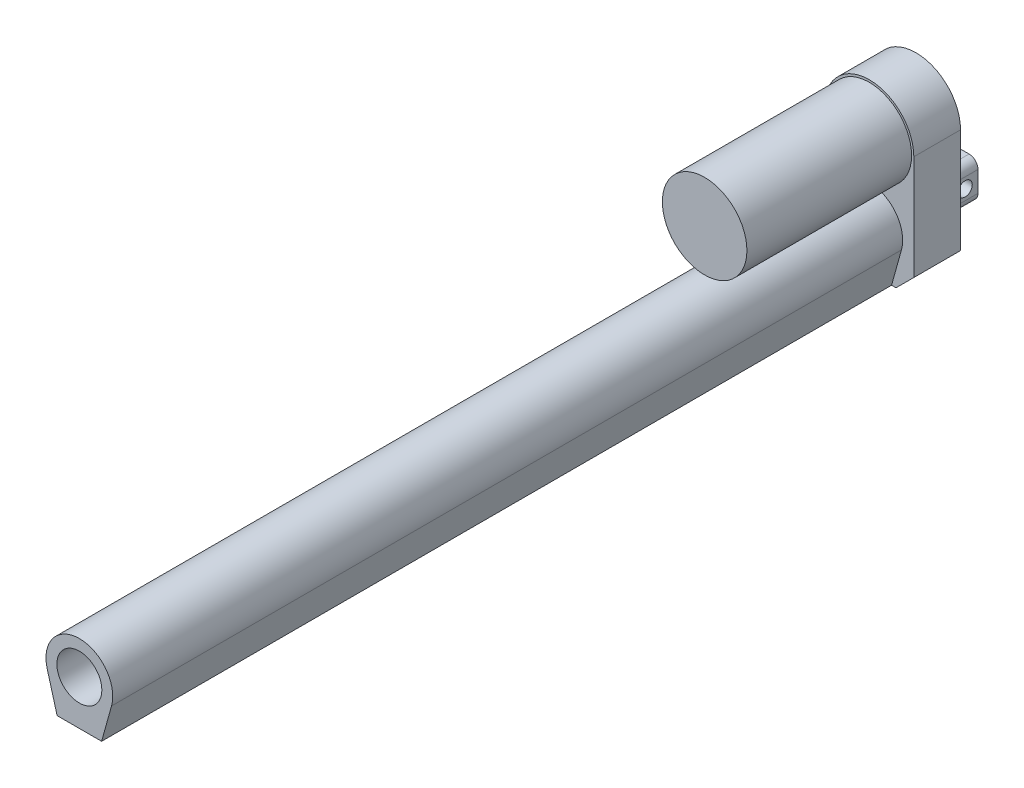
ISO-10303-21;
HEADER;
FILE_DESCRIPTION(('STEP AP214'),'2;1');
FILE_NAME('part.step','',(''),(''),'','','');
FILE_SCHEMA(('AUTOMOTIVE_DESIGN { 1 0 10303 214 1 1 1 1 }'));
ENDSEC;
DATA;
#1=APPLICATION_CONTEXT('core data for automotive mechanical design processes');
#2=APPLICATION_PROTOCOL_DEFINITION('international standard','automotive_design',2000,#1);
#3=PRODUCT_CONTEXT('',#1,'mechanical');
#4=PRODUCT('Part','Part','',(#3));
#5=PRODUCT_RELATED_PRODUCT_CATEGORY('part','',(#4));
#6=PRODUCT_DEFINITION_FORMATION('','',#4);
#7=PRODUCT_DEFINITION_CONTEXT('part definition',#1,'design');
#8=PRODUCT_DEFINITION('design','',#6,#7);
#9=PRODUCT_DEFINITION_SHAPE('','',#8);
#10=(LENGTH_UNIT() NAMED_UNIT(*) SI_UNIT(.MILLI.,.METRE.));
#11=(NAMED_UNIT(*) PLANE_ANGLE_UNIT() SI_UNIT($,.RADIAN.));
#12=(NAMED_UNIT(*) SI_UNIT($,.STERADIAN.) SOLID_ANGLE_UNIT());
#13=UNCERTAINTY_MEASURE_WITH_UNIT(LENGTH_MEASURE(1.E-05),#10,'distance_accuracy_value','');
#14=(GEOMETRIC_REPRESENTATION_CONTEXT(3) GLOBAL_UNCERTAINTY_ASSIGNED_CONTEXT((#13)) GLOBAL_UNIT_ASSIGNED_CONTEXT((#10,
#11,#12)) REPRESENTATION_CONTEXT('',''));
#15=CARTESIAN_POINT('',(0.,0.,0.));
#16=DIRECTION('',(0.,0.,1.));
#17=DIRECTION('',(1.,0.,0.));
#18=AXIS2_PLACEMENT_3D('',#15,#16,#17);
#19=CARTESIAN_POINT('',(0.,17.5,0.));
#20=DIRECTION('',(0.,0.,1.));
#21=DIRECTION('',(1.,0.,0.));
#22=AXIS2_PLACEMENT_3D('',#19,#20,#21);
#23=PLANE('',#22);
#24=DIRECTION('',(0.,-1.,0.));
#25=VECTOR('',#24,1.);
#26=CARTESIAN_POINT('',(-20.,-29.5,0.));
#27=LINE('',#26,#25);
#28=CARTESIAN_POINT('',(-20.,17.5,0.));
#29=VERTEX_POINT('',#28);
#30=CARTESIAN_POINT('',(-20.,-29.5,0.));
#31=VERTEX_POINT('',#30);
#32=EDGE_CURVE('E204',#29,#31,#27,.T.);
#33=ORIENTED_EDGE('',*,*,#32,.F.);
#34=CARTESIAN_POINT('',(0.,17.5,0.));
#35=DIRECTION('',(0.,0.,1.));
#36=DIRECTION('',(1.,0.,0.));
#37=AXIS2_PLACEMENT_3D('',#34,#35,#36);
#38=CIRCLE('',#37,20.);
#39=CARTESIAN_POINT('',(20.,17.5,0.));
#40=VERTEX_POINT('',#39);
#41=EDGE_CURVE('E210',#40,#29,#38,.T.);
#42=ORIENTED_EDGE('',*,*,#41,.F.);
#43=DIRECTION('',(0.,1.,0.));
#44=VECTOR('',#43,1.);
#45=CARTESIAN_POINT('',(20.,-29.5,0.));
#46=LINE('',#45,#44);
#47=CARTESIAN_POINT('',(20.,-29.5,0.));
#48=VERTEX_POINT('',#47);
#49=EDGE_CURVE('E231',#48,#40,#46,.T.);
#50=ORIENTED_EDGE('',*,*,#49,.F.);
#51=DIRECTION('',(0.707106781186546,0.707106781186549,0.));
#52=VECTOR('',#51,1.);
#53=CARTESIAN_POINT('',(12.,-37.5,0.));
#54=LINE('',#53,#52);
#55=CARTESIAN_POINT('',(12.,-37.5,0.));
#56=VERTEX_POINT('',#55);
#57=EDGE_CURVE('E229',#56,#48,#54,.T.);
#58=ORIENTED_EDGE('',*,*,#57,.F.);
#59=DIRECTION('',(1.,0.,0.));
#60=VECTOR('',#59,1.);
#61=CARTESIAN_POINT('',(-12.,-37.5,0.));
#62=LINE('',#61,#60);
#63=CARTESIAN_POINT('',(-12.,-37.5,0.));
#64=VERTEX_POINT('',#63);
#65=EDGE_CURVE('E227',#64,#56,#62,.T.);
#66=ORIENTED_EDGE('',*,*,#65,.F.);
#67=DIRECTION('',(0.707106781186546,-0.707106781186549,0.));
#68=VECTOR('',#67,1.);
#69=CARTESIAN_POINT('',(-12.,-37.5,0.));
#70=LINE('',#69,#68);
#71=EDGE_CURVE('E225',#31,#64,#70,.T.);
#72=ORIENTED_EDGE('',*,*,#71,.F.);
#73=EDGE_LOOP('',(#33,#42,#50,#58,#66,#72));
#74=FACE_BOUND('',#73,.T.);
#75=DIRECTION('',(0.,1.,0.));
#76=VECTOR('',#75,1.);
#77=CARTESIAN_POINT('',(-8.65000000000001,-26.5,0.));
#78=LINE('',#77,#76);
#79=CARTESIAN_POINT('',(-8.65000000000001,-22.5,0.));
#80=VERTEX_POINT('',#79);
#81=CARTESIAN_POINT('',(-8.65000000000001,-13.2,0.));
#82=VERTEX_POINT('',#81);
#83=EDGE_CURVE('E313',#80,#82,#78,.T.);
#84=ORIENTED_EDGE('',*,*,#83,.F.);
#85=CARTESIAN_POINT('',(-4.65000000000001,-22.5,0.));
#86=DIRECTION('',(0.,0.,1.));
#87=DIRECTION('',(1.,0.,0.));
#88=AXIS2_PLACEMENT_3D('',#85,#86,#87);
#89=CIRCLE('',#88,4.);
#90=CARTESIAN_POINT('',(-4.65000000000001,-26.5,0.));
#91=VERTEX_POINT('',#90);
#92=EDGE_CURVE('E11',#80,#91,#89,.T.);
#93=ORIENTED_EDGE('',*,*,#92,.T.);
#94=DIRECTION('',(-1.,0.,0.));
#95=VECTOR('',#94,1.);
#96=CARTESIAN_POINT('',(8.64999999999999,-26.5,0.));
#97=LINE('',#96,#95);
#98=CARTESIAN_POINT('',(4.64999999999999,-26.5,0.));
#99=VERTEX_POINT('',#98);
#100=EDGE_CURVE('E285',#99,#91,#97,.T.);
#101=ORIENTED_EDGE('',*,*,#100,.F.);
#102=CARTESIAN_POINT('',(4.64999999999999,-22.5,0.));
#103=DIRECTION('',(0.,0.,1.));
#104=DIRECTION('',(1.,0.,0.));
#105=AXIS2_PLACEMENT_3D('',#102,#103,#104);
#106=CIRCLE('',#105,4.);
#107=CARTESIAN_POINT('',(8.64999999999999,-22.5,0.));
#108=VERTEX_POINT('',#107);
#109=EDGE_CURVE('E53',#99,#108,#106,.T.);
#110=ORIENTED_EDGE('',*,*,#109,.T.);
#111=DIRECTION('',(0.,-1.,0.));
#112=VECTOR('',#111,1.);
#113=CARTESIAN_POINT('',(8.64999999999999,-26.5,0.));
#114=LINE('',#113,#112);
#115=CARTESIAN_POINT('',(8.64999999999999,-13.2,0.));
#116=VERTEX_POINT('',#115);
#117=EDGE_CURVE('E284',#116,#108,#114,.T.);
#118=ORIENTED_EDGE('',*,*,#117,.F.);
#119=CARTESIAN_POINT('',(4.64999999999999,-13.2,0.));
#120=DIRECTION('',(0.,0.,1.));
#121=DIRECTION('',(1.,0.,0.));
#122=AXIS2_PLACEMENT_3D('',#119,#120,#121);
#123=CIRCLE('',#122,4.);
#124=CARTESIAN_POINT('',(4.64999999999999,-9.19999999999999,0.));
#125=VERTEX_POINT('',#124);
#126=EDGE_CURVE('E280',#116,#125,#123,.T.);
#127=ORIENTED_EDGE('',*,*,#126,.T.);
#128=DIRECTION('',(1.,0.,0.));
#129=VECTOR('',#128,1.);
#130=CARTESIAN_POINT('',(8.64999999999999,-9.19999999999999,0.));
#131=LINE('',#130,#129);
#132=CARTESIAN_POINT('',(-4.65000000000001,-9.19999999999999,0.));
#133=VERTEX_POINT('',#132);
#134=EDGE_CURVE('E291',#133,#125,#131,.T.);
#135=ORIENTED_EDGE('',*,*,#134,.F.);
#136=CARTESIAN_POINT('',(-4.65000000000001,-13.2,0.));
#137=DIRECTION('',(0.,0.,1.));
#138=DIRECTION('',(1.,0.,0.));
#139=AXIS2_PLACEMENT_3D('',#136,#137,#138);
#140=CIRCLE('',#139,4.);
#141=EDGE_CURVE('E278',#133,#82,#140,.T.);
#142=ORIENTED_EDGE('',*,*,#141,.T.);
#143=EDGE_LOOP('',(#84,#93,#101,#110,#118,#127,#135,#142));
#144=FACE_BOUND('',#143,.T.);
#145=ADVANCED_FACE('F44',(#74,#144),#23,.F.);
#146=CARTESIAN_POINT('',(0.,17.5,21.));
#147=DIRECTION('',(0.,0.,1.));
#148=DIRECTION('',(1.,0.,0.));
#149=AXIS2_PLACEMENT_3D('',#146,#147,#148);
#150=PLANE('',#149);
#151=CARTESIAN_POINT('',(0.,17.5,21.));
#152=DIRECTION('',(0.,0.,1.));
#153=DIRECTION('',(1.,0.,0.));
#154=AXIS2_PLACEMENT_3D('',#151,#152,#153);
#155=CIRCLE('',#154,19.);
#156=CARTESIAN_POINT('',(19.,17.5,21.));
#157=VERTEX_POINT('',#156);
#158=EDGE_CURVE('E194',#157,#157,#155,.T.);
#159=ORIENTED_EDGE('',*,*,#158,.F.);
#160=EDGE_LOOP('',(#159));
#161=FACE_BOUND('',#160,.T.);
#162=DIRECTION('',(1.,0.,0.));
#163=VECTOR('',#162,1.);
#164=CARTESIAN_POINT('',(-12.,-37.5,21.));
#165=LINE('',#164,#163);
#166=CARTESIAN_POINT('',(-12.,-37.5,21.));
#167=VERTEX_POINT('',#166);
#168=CARTESIAN_POINT('',(-10.,-37.5,21.));
#169=VERTEX_POINT('',#168);
#170=EDGE_CURVE('E213',#167,#169,#165,.T.);
#171=ORIENTED_EDGE('',*,*,#170,.T.);
#172=DIRECTION('',(0.26833752096446,-0.96332495807108,0.));
#173=VECTOR('',#172,1.);
#174=CARTESIAN_POINT('',(-14.4498743710662,-21.5250628144669,21.));
#175=LINE('',#174,#173);
#176=CARTESIAN_POINT('',(-14.4498743710662,-21.5250628144669,21.));
#177=VERTEX_POINT('',#176);
#178=EDGE_CURVE('E307',#177,#169,#175,.T.);
#179=ORIENTED_EDGE('',*,*,#178,.F.);
#180=CARTESIAN_POINT('',(0.,-17.5,21.));
#181=DIRECTION('',(0.,0.,1.));
#182=DIRECTION('',(1.,0.,0.));
#183=AXIS2_PLACEMENT_3D('',#180,#181,#182);
#184=CIRCLE('',#183,15.);
#185=CARTESIAN_POINT('',(14.4498743710662,-21.5250628144669,21.));
#186=VERTEX_POINT('',#185);
#187=EDGE_CURVE('E192',#186,#177,#184,.T.);
#188=ORIENTED_EDGE('',*,*,#187,.F.);
#189=DIRECTION('',(0.26833752096446,0.96332495807108,0.));
#190=VECTOR('',#189,1.);
#191=CARTESIAN_POINT('',(14.4498743710662,-21.5250628144669,21.));
#192=LINE('',#191,#190);
#193=CARTESIAN_POINT('',(10.,-37.5,21.));
#194=VERTEX_POINT('',#193);
#195=EDGE_CURVE('E188',#194,#186,#192,.T.);
#196=ORIENTED_EDGE('',*,*,#195,.F.);
#197=CARTESIAN_POINT('',(12.,-37.5,21.));
#198=VERTEX_POINT('',#197);
#199=EDGE_CURVE('E212',#194,#198,#165,.T.);
#200=ORIENTED_EDGE('',*,*,#199,.T.);
#201=DIRECTION('',(0.707106781186546,0.707106781186549,0.));
#202=VECTOR('',#201,1.);
#203=CARTESIAN_POINT('',(12.,-37.5,21.));
#204=LINE('',#203,#202);
#205=CARTESIAN_POINT('',(20.,-29.5,21.));
#206=VERTEX_POINT('',#205);
#207=EDGE_CURVE('E216',#198,#206,#204,.T.);
#208=ORIENTED_EDGE('',*,*,#207,.T.);
#209=DIRECTION('',(0.,1.,0.));
#210=VECTOR('',#209,1.);
#211=CARTESIAN_POINT('',(20.,-29.5,21.));
#212=LINE('',#211,#210);
#213=CARTESIAN_POINT('',(20.,17.5,21.));
#214=VERTEX_POINT('',#213);
#215=EDGE_CURVE('E218',#206,#214,#212,.T.);
#216=ORIENTED_EDGE('',*,*,#215,.T.);
#217=CARTESIAN_POINT('',(0.,17.5,21.));
#218=DIRECTION('',(0.,0.,1.));
#219=DIRECTION('',(1.,0.,0.));
#220=AXIS2_PLACEMENT_3D('',#217,#218,#219);
#221=CIRCLE('',#220,20.);
#222=CARTESIAN_POINT('',(-20.,17.5,21.));
#223=VERTEX_POINT('',#222);
#224=EDGE_CURVE('E220',#214,#223,#221,.T.);
#225=ORIENTED_EDGE('',*,*,#224,.T.);
#226=DIRECTION('',(0.,-1.,0.));
#227=VECTOR('',#226,1.);
#228=CARTESIAN_POINT('',(-20.,-29.5,21.));
#229=LINE('',#228,#227);
#230=CARTESIAN_POINT('',(-20.,-29.5,21.));
#231=VERTEX_POINT('',#230);
#232=EDGE_CURVE('E206',#223,#231,#229,.T.);
#233=ORIENTED_EDGE('',*,*,#232,.T.);
#234=DIRECTION('',(0.707106781186546,-0.707106781186549,0.));
#235=VECTOR('',#234,1.);
#236=CARTESIAN_POINT('',(-12.,-37.5,21.));
#237=LINE('',#236,#235);
#238=EDGE_CURVE('E209',#231,#167,#237,.T.);
#239=ORIENTED_EDGE('',*,*,#238,.T.);
#240=EDGE_LOOP('',(#171,#179,#188,#196,#200,#208,#216,#225,#233,#239));
#241=FACE_BOUND('',#240,.T.);
#242=ADVANCED_FACE('F333',(#161,#241),#150,.T.);
#243=CARTESIAN_POINT('',(-20.,-29.5,21.));
#244=DIRECTION('',(1.,0.,0.));
#245=DIRECTION('',(0.,1.,0.));
#246=AXIS2_PLACEMENT_3D('',#243,#244,#245);
#247=PLANE('',#246);
#248=ORIENTED_EDGE('',*,*,#32,.T.);
#249=DIRECTION('',(0.,0.,-1.));
#250=VECTOR('',#249,1.);
#251=CARTESIAN_POINT('',(-20.,-29.5,21.));
#252=LINE('',#251,#250);
#253=EDGE_CURVE('E248',#231,#31,#252,.T.);
#254=ORIENTED_EDGE('',*,*,#253,.F.);
#255=ORIENTED_EDGE('',*,*,#232,.F.);
#256=DIRECTION('',(0.,0.,-1.));
#257=VECTOR('',#256,1.);
#258=CARTESIAN_POINT('',(-20.,17.5,21.));
#259=LINE('',#258,#257);
#260=EDGE_CURVE('E222',#223,#29,#259,.T.);
#261=ORIENTED_EDGE('',*,*,#260,.T.);
#262=EDGE_LOOP('',(#248,#254,#255,#261));
#263=FACE_BOUND('',#262,.T.);
#264=ADVANCED_FACE('F356',(#263),#247,.F.);
#265=CARTESIAN_POINT('',(-12.,-37.5,21.));
#266=DIRECTION('',(0.707106781186549,0.707106781186546,0.));
#267=DIRECTION('',(-0.707106781186546,0.707106781186549,0.));
#268=AXIS2_PLACEMENT_3D('',#265,#266,#267);
#269=PLANE('',#268);
#270=ORIENTED_EDGE('',*,*,#71,.T.);
#271=DIRECTION('',(0.,0.,-1.));
#272=VECTOR('',#271,1.);
#273=CARTESIAN_POINT('',(-12.,-37.5,21.));
#274=LINE('',#273,#272);
#275=EDGE_CURVE('E245',#167,#64,#274,.T.);
#276=ORIENTED_EDGE('',*,*,#275,.F.);
#277=ORIENTED_EDGE('',*,*,#238,.F.);
#278=ORIENTED_EDGE('',*,*,#253,.T.);
#279=EDGE_LOOP('',(#270,#276,#277,#278));
#280=FACE_BOUND('',#279,.T.);
#281=ADVANCED_FACE('F360',(#280),#269,.F.);
#282=CARTESIAN_POINT('',(-12.,-37.5,21.));
#283=DIRECTION('',(0.,1.,0.));
#284=DIRECTION('',(0.,0.,1.));
#285=AXIS2_PLACEMENT_3D('',#282,#283,#284);
#286=PLANE('',#285);
#287=ORIENTED_EDGE('',*,*,#65,.T.);
#288=DIRECTION('',(0.,0.,-1.));
#289=VECTOR('',#288,1.);
#290=CARTESIAN_POINT('',(12.,-37.5,21.));
#291=LINE('',#290,#289);
#292=EDGE_CURVE('E242',#198,#56,#291,.T.);
#293=ORIENTED_EDGE('',*,*,#292,.F.);
#294=ORIENTED_EDGE('',*,*,#199,.F.);
#295=DIRECTION('',(0.,0.,-1.));
#296=VECTOR('',#295,1.);
#297=CARTESIAN_POINT('',(10.,-37.5,376.));
#298=LINE('',#297,#296);
#299=CARTESIAN_POINT('',(10.,-37.5,376.));
#300=VERTEX_POINT('',#299);
#301=EDGE_CURVE('E199',#300,#194,#298,.T.);
#302=ORIENTED_EDGE('',*,*,#301,.F.);
#303=DIRECTION('',(1.,0.,0.));
#304=VECTOR('',#303,1.);
#305=CARTESIAN_POINT('',(-10.,-37.5,376.));
#306=LINE('',#305,#304);
#307=CARTESIAN_POINT('',(-10.,-37.5,376.));
#308=VERTEX_POINT('',#307);
#309=EDGE_CURVE('E178',#308,#300,#306,.T.);
#310=ORIENTED_EDGE('',*,*,#309,.F.);
#311=DIRECTION('',(0.,0.,-1.));
#312=VECTOR('',#311,1.);
#313=CARTESIAN_POINT('',(-10.,-37.5,376.));
#314=LINE('',#313,#312);
#315=EDGE_CURVE('E175',#308,#169,#314,.T.);
#316=ORIENTED_EDGE('',*,*,#315,.T.);
#317=ORIENTED_EDGE('',*,*,#170,.F.);
#318=ORIENTED_EDGE('',*,*,#275,.T.);
#319=EDGE_LOOP('',(#287,#293,#294,#302,#310,#316,#317,#318));
#320=FACE_BOUND('',#319,.T.);
#321=ADVANCED_FACE('F335',(#320),#286,.F.);
#322=CARTESIAN_POINT('',(12.,-37.5,21.));
#323=DIRECTION('',(-0.707106781186549,0.707106781186546,0.));
#324=DIRECTION('',(-0.707106781186546,-0.707106781186549,0.));
#325=AXIS2_PLACEMENT_3D('',#322,#323,#324);
#326=PLANE('',#325);
#327=ORIENTED_EDGE('',*,*,#57,.T.);
#328=DIRECTION('',(0.,0.,-1.));
#329=VECTOR('',#328,1.);
#330=CARTESIAN_POINT('',(20.,-29.5,21.));
#331=LINE('',#330,#329);
#332=EDGE_CURVE('E239',#206,#48,#331,.T.);
#333=ORIENTED_EDGE('',*,*,#332,.F.);
#334=ORIENTED_EDGE('',*,*,#207,.F.);
#335=ORIENTED_EDGE('',*,*,#292,.T.);
#336=EDGE_LOOP('',(#327,#333,#334,#335));
#337=FACE_BOUND('',#336,.T.);
#338=ADVANCED_FACE('F341',(#337),#326,.F.);
#339=CARTESIAN_POINT('',(20.,-29.5,21.));
#340=DIRECTION('',(-1.,0.,0.));
#341=DIRECTION('',(0.,-1.,0.));
#342=AXIS2_PLACEMENT_3D('',#339,#340,#341);
#343=PLANE('',#342);
#344=ORIENTED_EDGE('',*,*,#49,.T.);
#345=DIRECTION('',(0.,0.,-1.));
#346=VECTOR('',#345,1.);
#347=CARTESIAN_POINT('',(20.,17.5,21.));
#348=LINE('',#347,#346);
#349=EDGE_CURVE('E236',#214,#40,#348,.T.);
#350=ORIENTED_EDGE('',*,*,#349,.F.);
#351=ORIENTED_EDGE('',*,*,#215,.F.);
#352=ORIENTED_EDGE('',*,*,#332,.T.);
#353=EDGE_LOOP('',(#344,#350,#351,#352));
#354=FACE_BOUND('',#353,.T.);
#355=ADVANCED_FACE('F347',(#354),#343,.F.);
#356=CARTESIAN_POINT('',(0.,17.5,21.));
#357=DIRECTION('',(0.,0.,-1.));
#358=DIRECTION('',(-1.,0.,0.));
#359=AXIS2_PLACEMENT_3D('',#356,#357,#358);
#360=CYLINDRICAL_SURFACE('',#359,20.);
#361=ORIENTED_EDGE('',*,*,#41,.T.);
#362=ORIENTED_EDGE('',*,*,#260,.F.);
#363=ORIENTED_EDGE('',*,*,#224,.F.);
#364=ORIENTED_EDGE('',*,*,#349,.T.);
#365=EDGE_LOOP('',(#361,#362,#363,#364));
#366=FACE_BOUND('',#365,.T.);
#367=ADVANCED_FACE('F351',(#366),#360,.T.);
#368=CARTESIAN_POINT('',(0.,17.5,95.));
#369=DIRECTION('',(0.,0.,-1.));
#370=DIRECTION('',(-1.,0.,0.));
#371=AXIS2_PLACEMENT_3D('',#368,#369,#370);
#372=CYLINDRICAL_SURFACE('',#371,19.);
#373=CARTESIAN_POINT('',(0.,17.5,95.));
#374=DIRECTION('',(0.,0.,1.));
#375=DIRECTION('',(1.,0.,0.));
#376=AXIS2_PLACEMENT_3D('',#373,#374,#375);
#377=CIRCLE('',#376,19.);
#378=CARTESIAN_POINT('',(19.,17.5,95.));
#379=VERTEX_POINT('',#378);
#380=EDGE_CURVE('E197',#379,#379,#377,.T.);
#381=ORIENTED_EDGE('',*,*,#380,.F.);
#382=EDGE_LOOP('',(#381));
#383=FACE_BOUND('',#382,.T.);
#384=ORIENTED_EDGE('',*,*,#158,.T.);
#385=EDGE_LOOP('',(#384));
#386=FACE_BOUND('',#385,.T.);
#387=ADVANCED_FACE('F373',(#383,#386),#372,.T.);
#388=CARTESIAN_POINT('',(0.,17.5,95.));
#389=DIRECTION('',(0.,0.,1.));
#390=DIRECTION('',(1.,0.,0.));
#391=AXIS2_PLACEMENT_3D('',#388,#389,#390);
#392=PLANE('',#391);
#393=ORIENTED_EDGE('',*,*,#380,.T.);
#394=EDGE_LOOP('',(#393));
#395=FACE_BOUND('',#394,.T.);
#396=ADVANCED_FACE('F456',(#395),#392,.T.);
#397=CARTESIAN_POINT('',(0.,-17.5,376.));
#398=DIRECTION('',(0.,0.,-1.));
#399=DIRECTION('',(-1.,0.,0.));
#400=AXIS2_PLACEMENT_3D('',#397,#398,#399);
#401=CYLINDRICAL_SURFACE('',#400,15.);
#402=ORIENTED_EDGE('',*,*,#187,.T.);
#403=DIRECTION('',(0.,0.,-1.));
#404=VECTOR('',#403,1.);
#405=CARTESIAN_POINT('',(-14.4498743710662,-21.5250628144669,376.));
#406=LINE('',#405,#404);
#407=CARTESIAN_POINT('',(-14.4498743710662,-21.5250628144669,376.));
#408=VERTEX_POINT('',#407);
#409=EDGE_CURVE('E172',#408,#177,#406,.T.);
#410=ORIENTED_EDGE('',*,*,#409,.F.);
#411=CARTESIAN_POINT('',(0.,-17.5,376.));
#412=DIRECTION('',(0.,0.,1.));
#413=DIRECTION('',(1.,0.,0.));
#414=AXIS2_PLACEMENT_3D('',#411,#412,#413);
#415=CIRCLE('',#414,15.);
#416=CARTESIAN_POINT('',(14.4498743710662,-21.5250628144669,376.));
#417=VERTEX_POINT('',#416);
#418=EDGE_CURVE('E179',#417,#408,#415,.T.);
#419=ORIENTED_EDGE('',*,*,#418,.F.);
#420=DIRECTION('',(0.,0.,-1.));
#421=VECTOR('',#420,1.);
#422=CARTESIAN_POINT('',(14.4498743710662,-21.5250628144669,376.));
#423=LINE('',#422,#421);
#424=EDGE_CURVE('E322',#417,#186,#423,.T.);
#425=ORIENTED_EDGE('',*,*,#424,.T.);
#426=EDGE_LOOP('',(#402,#410,#419,#425));
#427=FACE_BOUND('',#426,.T.);
#428=ADVANCED_FACE('F190',(#427),#401,.T.);
#429=CARTESIAN_POINT('',(-14.4498743710662,-21.5250628144669,376.));
#430=DIRECTION('',(0.96332495807108,0.26833752096446,0.));
#431=DIRECTION('',(-0.26833752096446,0.96332495807108,0.));
#432=AXIS2_PLACEMENT_3D('',#429,#430,#431);
#433=PLANE('',#432);
#434=ORIENTED_EDGE('',*,*,#178,.T.);
#435=ORIENTED_EDGE('',*,*,#315,.F.);
#436=DIRECTION('',(0.26833752096446,-0.96332495807108,0.));
#437=VECTOR('',#436,1.);
#438=CARTESIAN_POINT('',(-14.4498743710662,-21.5250628144669,376.));
#439=LINE('',#438,#437);
#440=EDGE_CURVE('E168',#408,#308,#439,.T.);
#441=ORIENTED_EDGE('',*,*,#440,.F.);
#442=ORIENTED_EDGE('',*,*,#409,.T.);
#443=EDGE_LOOP('',(#434,#435,#441,#442));
#444=FACE_BOUND('',#443,.T.);
#445=ADVANCED_FACE('F170',(#444),#433,.F.);
#446=CARTESIAN_POINT('',(14.4498743710662,-21.5250628144669,376.));
#447=DIRECTION('',(-0.96332495807108,0.26833752096446,0.));
#448=DIRECTION('',(-0.26833752096446,-0.96332495807108,0.));
#449=AXIS2_PLACEMENT_3D('',#446,#447,#448);
#450=PLANE('',#449);
#451=ORIENTED_EDGE('',*,*,#195,.T.);
#452=ORIENTED_EDGE('',*,*,#424,.F.);
#453=DIRECTION('',(0.26833752096446,0.96332495807108,0.));
#454=VECTOR('',#453,1.);
#455=CARTESIAN_POINT('',(14.4498743710662,-21.5250628144669,376.));
#456=LINE('',#455,#454);
#457=EDGE_CURVE('E184',#300,#417,#456,.T.);
#458=ORIENTED_EDGE('',*,*,#457,.F.);
#459=ORIENTED_EDGE('',*,*,#301,.T.);
#460=EDGE_LOOP('',(#451,#452,#458,#459));
#461=FACE_BOUND('',#460,.T.);
#462=ADVANCED_FACE('F329',(#461),#450,.F.);
#463=CARTESIAN_POINT('',(0.,-17.5,376.));
#464=DIRECTION('',(0.,0.,1.));
#465=DIRECTION('',(1.,0.,0.));
#466=AXIS2_PLACEMENT_3D('',#463,#464,#465);
#467=PLANE('',#466);
#468=CARTESIAN_POINT('',(0.,-17.5,376.));
#469=DIRECTION('',(0.,0.,1.));
#470=DIRECTION('',(1.,0.,0.));
#471=AXIS2_PLACEMENT_3D('',#468,#469,#470);
#472=CIRCLE('',#471,10.1);
#473=CARTESIAN_POINT('',(10.1,-17.5,376.));
#474=VERTEX_POINT('',#473);
#475=EDGE_CURVE('E412',#474,#474,#472,.T.);
#476=ORIENTED_EDGE('',*,*,#475,.F.);
#477=EDGE_LOOP('',(#476));
#478=FACE_BOUND('',#477,.T.);
#479=ORIENTED_EDGE('',*,*,#418,.T.);
#480=ORIENTED_EDGE('',*,*,#440,.T.);
#481=ORIENTED_EDGE('',*,*,#309,.T.);
#482=ORIENTED_EDGE('',*,*,#457,.T.);
#483=EDGE_LOOP('',(#479,#480,#481,#482));
#484=FACE_BOUND('',#483,.T.);
#485=ADVANCED_FACE('F182',(#478,#484),#467,.T.);
#486=CARTESIAN_POINT('',(-8.65000000000001,-26.5,-19.2));
#487=DIRECTION('',(1.,0.,0.));
#488=DIRECTION('',(0.,0.,-1.));
#489=AXIS2_PLACEMENT_3D('',#486,#487,#488);
#490=PLANE('',#489);
#491=CARTESIAN_POINT('',(-8.65000000000001,-17.85,-13.45));
#492=DIRECTION('',(1.,0.,0.));
#493=DIRECTION('',(0.,0.,-1.));
#494=AXIS2_PLACEMENT_3D('',#491,#492,#493);
#495=CIRCLE('',#494,3.175);
#496=CARTESIAN_POINT('',(-8.65000000000001,-17.85,-16.625));
#497=VERTEX_POINT('',#496);
#498=EDGE_CURVE('E415',#497,#497,#495,.T.);
#499=ORIENTED_EDGE('',*,*,#498,.T.);
#500=EDGE_LOOP('',(#499));
#501=FACE_BOUND('',#500,.T.);
#502=ORIENTED_EDGE('',*,*,#83,.T.);
#503=DIRECTION('',(0.,0.,1.));
#504=VECTOR('',#503,1.);
#505=CARTESIAN_POINT('',(-8.65000000000001,-13.2,-19.2));
#506=LINE('',#505,#504);
#507=CARTESIAN_POINT('',(-8.65000000000001,-13.2,-19.2));
#508=VERTEX_POINT('',#507);
#509=EDGE_CURVE('E259',#82,#508,#506,.F.);
#510=ORIENTED_EDGE('',*,*,#509,.T.);
#511=DIRECTION('',(0.,1.,0.));
#512=VECTOR('',#511,1.);
#513=CARTESIAN_POINT('',(-8.65000000000001,-26.5,-19.2));
#514=LINE('',#513,#512);
#515=CARTESIAN_POINT('',(-8.65000000000001,-22.5,-19.2));
#516=VERTEX_POINT('',#515);
#517=EDGE_CURVE('E319',#516,#508,#514,.T.);
#518=ORIENTED_EDGE('',*,*,#517,.F.);
#519=DIRECTION('',(0.,0.,1.));
#520=VECTOR('',#519,1.);
#521=CARTESIAN_POINT('',(-8.65000000000001,-22.5,-19.2));
#522=LINE('',#521,#520);
#523=EDGE_CURVE('E256',#516,#80,#522,.T.);
#524=ORIENTED_EDGE('',*,*,#523,.T.);
#525=EDGE_LOOP('',(#502,#510,#518,#524));
#526=FACE_BOUND('',#525,.T.);
#527=ADVANCED_FACE('F407',(#501,#526),#490,.F.);
#528=CARTESIAN_POINT('',(8.64999999999999,-9.19999999999999,-19.2));
#529=DIRECTION('',(0.,-1.,0.));
#530=DIRECTION('',(0.,0.,-1.));
#531=AXIS2_PLACEMENT_3D('',#528,#529,#530);
#532=PLANE('',#531);
#533=DIRECTION('',(1.,0.,0.));
#534=VECTOR('',#533,1.);
#535=CARTESIAN_POINT('',(8.64999999999999,-9.19999999999999,-19.2));
#536=LINE('',#535,#534);
#537=CARTESIAN_POINT('',(-4.65000000000001,-9.19999999999999,-19.2));
#538=VERTEX_POINT('',#537);
#539=CARTESIAN_POINT('',(4.64999999999999,-9.19999999999999,-19.2));
#540=VERTEX_POINT('',#539);
#541=EDGE_CURVE('E309',#538,#540,#536,.T.);
#542=ORIENTED_EDGE('',*,*,#541,.F.);
#543=DIRECTION('',(0.,0.,1.));
#544=VECTOR('',#543,1.);
#545=CARTESIAN_POINT('',(-4.65000000000001,-9.19999999999999,-19.2));
#546=LINE('',#545,#544);
#547=EDGE_CURVE('E253',#538,#133,#546,.T.);
#548=ORIENTED_EDGE('',*,*,#547,.T.);
#549=ORIENTED_EDGE('',*,*,#134,.T.);
#550=DIRECTION('',(0.,0.,1.));
#551=VECTOR('',#550,1.);
#552=CARTESIAN_POINT('',(4.64999999999999,-9.19999999999999,-19.2));
#553=LINE('',#552,#551);
#554=EDGE_CURVE('E251',#125,#540,#553,.F.);
#555=ORIENTED_EDGE('',*,*,#554,.T.);
#556=EDGE_LOOP('',(#542,#548,#549,#555));
#557=FACE_BOUND('',#556,.T.);
#558=ADVANCED_FACE('F441',(#557),#532,.F.);
#559=CARTESIAN_POINT('',(8.64999999999999,-26.5,-19.2));
#560=DIRECTION('',(-1.,0.,0.));
#561=DIRECTION('',(0.,0.,1.));
#562=AXIS2_PLACEMENT_3D('',#559,#560,#561);
#563=PLANE('',#562);
#564=CARTESIAN_POINT('',(8.64999999999999,-17.85,-13.45));
#565=DIRECTION('',(-1.,0.,0.));
#566=DIRECTION('',(0.,0.,1.));
#567=AXIS2_PLACEMENT_3D('',#564,#565,#566);
#568=CIRCLE('',#567,3.175);
#569=CARTESIAN_POINT('',(8.64999999999999,-17.85,-10.275));
#570=VERTEX_POINT('',#569);
#571=EDGE_CURVE('E48',#570,#570,#568,.T.);
#572=ORIENTED_EDGE('',*,*,#571,.T.);
#573=EDGE_LOOP('',(#572));
#574=FACE_BOUND('',#573,.T.);
#575=DIRECTION('',(0.,-1.,0.));
#576=VECTOR('',#575,1.);
#577=CARTESIAN_POINT('',(8.64999999999999,-26.5,-19.2));
#578=LINE('',#577,#576);
#579=CARTESIAN_POINT('',(8.64999999999999,-13.2,-19.2));
#580=VERTEX_POINT('',#579);
#581=CARTESIAN_POINT('',(8.64999999999999,-22.5,-19.2));
#582=VERTEX_POINT('',#581);
#583=EDGE_CURVE('E302',#580,#582,#578,.T.);
#584=ORIENTED_EDGE('',*,*,#583,.F.);
#585=DIRECTION('',(0.,0.,1.));
#586=VECTOR('',#585,1.);
#587=CARTESIAN_POINT('',(8.64999999999999,-13.2,-19.2));
#588=LINE('',#587,#586);
#589=EDGE_CURVE('E271',#580,#116,#588,.T.);
#590=ORIENTED_EDGE('',*,*,#589,.T.);
#591=ORIENTED_EDGE('',*,*,#117,.T.);
#592=DIRECTION('',(0.,0.,1.));
#593=VECTOR('',#592,1.);
#594=CARTESIAN_POINT('',(8.64999999999999,-22.5,-19.2));
#595=LINE('',#594,#593);
#596=EDGE_CURVE('E269',#108,#582,#595,.F.);
#597=ORIENTED_EDGE('',*,*,#596,.T.);
#598=EDGE_LOOP('',(#584,#590,#591,#597));
#599=FACE_BOUND('',#598,.T.);
#600=ADVANCED_FACE('F288',(#574,#599),#563,.F.);
#601=CARTESIAN_POINT('',(8.64999999999999,-26.5,-19.2));
#602=DIRECTION('',(0.,1.,0.));
#603=DIRECTION('',(0.,0.,1.));
#604=AXIS2_PLACEMENT_3D('',#601,#602,#603);
#605=PLANE('',#604);
#606=DIRECTION('',(-1.,0.,0.));
#607=VECTOR('',#606,1.);
#608=CARTESIAN_POINT('',(8.64999999999999,-26.5,-19.2));
#609=LINE('',#608,#607);
#610=CARTESIAN_POINT('',(4.64999999999999,-26.5,-19.2));
#611=VERTEX_POINT('',#610);
#612=CARTESIAN_POINT('',(-4.65000000000001,-26.5,-19.2));
#613=VERTEX_POINT('',#612);
#614=EDGE_CURVE('E300',#611,#613,#609,.T.);
#615=ORIENTED_EDGE('',*,*,#614,.F.);
#616=DIRECTION('',(0.,0.,1.));
#617=VECTOR('',#616,1.);
#618=CARTESIAN_POINT('',(4.64999999999999,-26.5,-19.2));
#619=LINE('',#618,#617);
#620=EDGE_CURVE('E276',#611,#99,#619,.T.);
#621=ORIENTED_EDGE('',*,*,#620,.T.);
#622=ORIENTED_EDGE('',*,*,#100,.T.);
#623=DIRECTION('',(0.,0.,1.));
#624=VECTOR('',#623,1.);
#625=CARTESIAN_POINT('',(-4.65000000000001,-26.5,-19.2));
#626=LINE('',#625,#624);
#627=EDGE_CURVE('E274',#91,#613,#626,.F.);
#628=ORIENTED_EDGE('',*,*,#627,.T.);
#629=EDGE_LOOP('',(#615,#621,#622,#628));
#630=FACE_BOUND('',#629,.T.);
#631=ADVANCED_FACE('F304',(#630),#605,.F.);
#632=CARTESIAN_POINT('',(0.,0.,-19.2));
#633=DIRECTION('',(0.,0.,1.));
#634=DIRECTION('',(1.,0.,0.));
#635=AXIS2_PLACEMENT_3D('',#632,#633,#634);
#636=PLANE('',#635);
#637=ORIENTED_EDGE('',*,*,#517,.T.);
#638=CARTESIAN_POINT('',(-4.65000000000001,-13.2,-19.2));
#639=DIRECTION('',(0.,0.,1.));
#640=DIRECTION('',(1.,0.,0.));
#641=AXIS2_PLACEMENT_3D('',#638,#639,#640);
#642=CIRCLE('',#641,4.);
#643=EDGE_CURVE('E267',#508,#538,#642,.F.);
#644=ORIENTED_EDGE('',*,*,#643,.T.);
#645=ORIENTED_EDGE('',*,*,#541,.T.);
#646=CARTESIAN_POINT('',(4.64999999999999,-13.2,-19.2));
#647=DIRECTION('',(0.,0.,1.));
#648=DIRECTION('',(1.,0.,0.));
#649=AXIS2_PLACEMENT_3D('',#646,#647,#648);
#650=CIRCLE('',#649,4.);
#651=EDGE_CURVE('E265',#540,#580,#650,.F.);
#652=ORIENTED_EDGE('',*,*,#651,.T.);
#653=ORIENTED_EDGE('',*,*,#583,.T.);
#654=CARTESIAN_POINT('',(4.64999999999999,-22.5,-19.2));
#655=DIRECTION('',(0.,0.,1.));
#656=DIRECTION('',(1.,0.,0.));
#657=AXIS2_PLACEMENT_3D('',#654,#655,#656);
#658=CIRCLE('',#657,4.);
#659=EDGE_CURVE('E263',#582,#611,#658,.F.);
#660=ORIENTED_EDGE('',*,*,#659,.T.);
#661=ORIENTED_EDGE('',*,*,#614,.T.);
#662=CARTESIAN_POINT('',(-4.65000000000001,-22.5,-19.2));
#663=DIRECTION('',(0.,0.,1.));
#664=DIRECTION('',(1.,0.,0.));
#665=AXIS2_PLACEMENT_3D('',#662,#663,#664);
#666=CIRCLE('',#665,4.);
#667=EDGE_CURVE('E261',#613,#516,#666,.F.);
#668=ORIENTED_EDGE('',*,*,#667,.T.);
#669=EDGE_LOOP('',(#637,#644,#645,#652,#653,#660,#661,#668));
#670=FACE_BOUND('',#669,.T.);
#671=ADVANCED_FACE('F299',(#670),#636,.F.);
#672=CARTESIAN_POINT('',(-4.65000000000001,-13.2,-19.2));
#673=DIRECTION('',(0.,0.,1.));
#674=DIRECTION('',(1.,0.,0.));
#675=AXIS2_PLACEMENT_3D('',#672,#673,#674);
#676=CYLINDRICAL_SURFACE('',#675,4.);
#677=ORIENTED_EDGE('',*,*,#643,.F.);
#678=ORIENTED_EDGE('',*,*,#509,.F.);
#679=ORIENTED_EDGE('',*,*,#141,.F.);
#680=ORIENTED_EDGE('',*,*,#547,.F.);
#681=EDGE_LOOP('',(#677,#678,#679,#680));
#682=FACE_BOUND('',#681,.T.);
#683=ADVANCED_FACE('F384',(#682),#676,.T.);
#684=CARTESIAN_POINT('',(4.64999999999999,-13.2,-19.2));
#685=DIRECTION('',(0.,0.,1.));
#686=DIRECTION('',(1.,0.,0.));
#687=AXIS2_PLACEMENT_3D('',#684,#685,#686);
#688=CYLINDRICAL_SURFACE('',#687,4.);
#689=ORIENTED_EDGE('',*,*,#651,.F.);
#690=ORIENTED_EDGE('',*,*,#554,.F.);
#691=ORIENTED_EDGE('',*,*,#126,.F.);
#692=ORIENTED_EDGE('',*,*,#589,.F.);
#693=EDGE_LOOP('',(#689,#690,#691,#692));
#694=FACE_BOUND('',#693,.T.);
#695=ADVANCED_FACE('F387',(#694),#688,.T.);
#696=CARTESIAN_POINT('',(4.64999999999999,-22.5,-19.2));
#697=DIRECTION('',(0.,0.,1.));
#698=DIRECTION('',(1.,0.,0.));
#699=AXIS2_PLACEMENT_3D('',#696,#697,#698);
#700=CYLINDRICAL_SURFACE('',#699,4.);
#701=ORIENTED_EDGE('',*,*,#659,.F.);
#702=ORIENTED_EDGE('',*,*,#596,.F.);
#703=ORIENTED_EDGE('',*,*,#109,.F.);
#704=ORIENTED_EDGE('',*,*,#620,.F.);
#705=EDGE_LOOP('',(#701,#702,#703,#704));
#706=FACE_BOUND('',#705,.T.);
#707=ADVANCED_FACE('F294',(#706),#700,.T.);
#708=CARTESIAN_POINT('',(-4.65000000000001,-22.5,-19.2));
#709=DIRECTION('',(0.,0.,1.));
#710=DIRECTION('',(1.,0.,0.));
#711=AXIS2_PLACEMENT_3D('',#708,#709,#710);
#712=CYLINDRICAL_SURFACE('',#711,4.);
#713=ORIENTED_EDGE('',*,*,#667,.F.);
#714=ORIENTED_EDGE('',*,*,#627,.F.);
#715=ORIENTED_EDGE('',*,*,#92,.F.);
#716=ORIENTED_EDGE('',*,*,#523,.F.);
#717=EDGE_LOOP('',(#713,#714,#715,#716));
#718=FACE_BOUND('',#717,.T.);
#719=ADVANCED_FACE('F46',(#718),#712,.T.);
#720=CARTESIAN_POINT('',(0.,-17.5,76.));
#721=DIRECTION('',(0.,0.,1.));
#722=DIRECTION('',(1.,0.,0.));
#723=AXIS2_PLACEMENT_3D('',#720,#721,#722);
#724=CYLINDRICAL_SURFACE('',#723,10.1);
#725=CARTESIAN_POINT('',(0.,-17.5,76.));
#726=DIRECTION('',(0.,0.,1.));
#727=DIRECTION('',(1.,0.,0.));
#728=AXIS2_PLACEMENT_3D('',#725,#726,#727);
#729=CIRCLE('',#728,10.1);
#730=CARTESIAN_POINT('',(10.1,-17.5,76.));
#731=VERTEX_POINT('',#730);
#732=EDGE_CURVE('E316',#731,#731,#729,.T.);
#733=ORIENTED_EDGE('',*,*,#732,.F.);
#734=EDGE_LOOP('',(#733));
#735=FACE_BOUND('',#734,.T.);
#736=ORIENTED_EDGE('',*,*,#475,.T.);
#737=EDGE_LOOP('',(#736));
#738=FACE_BOUND('',#737,.T.);
#739=ADVANCED_FACE('F395',(#735,#738),#724,.F.);
#740=CARTESIAN_POINT('',(0.,-17.5,76.));
#741=DIRECTION('',(0.,0.,1.));
#742=DIRECTION('',(1.,0.,0.));
#743=AXIS2_PLACEMENT_3D('',#740,#741,#742);
#744=PLANE('',#743);
#745=ORIENTED_EDGE('',*,*,#732,.T.);
#746=EDGE_LOOP('',(#745));
#747=FACE_BOUND('',#746,.T.);
#748=ADVANCED_FACE('F400',(#747),#744,.T.);
#749=CARTESIAN_POINT('',(-20.,-17.85,-13.45));
#750=DIRECTION('',(1.,0.,0.));
#751=DIRECTION('',(0.,0.,-1.));
#752=AXIS2_PLACEMENT_3D('',#749,#750,#751);
#753=CYLINDRICAL_SURFACE('',#752,3.175);
#754=ORIENTED_EDGE('',*,*,#571,.F.);
#755=EDGE_LOOP('',(#754));
#756=FACE_BOUND('',#755,.T.);
#757=ORIENTED_EDGE('',*,*,#498,.F.);
#758=EDGE_LOOP('',(#757));
#759=FACE_BOUND('',#758,.T.);
#760=ADVANCED_FACE('F425',(#756,#759),#753,.F.);
#761=CLOSED_SHELL('',(#145,#242,#264,#281,#321,#338,#355,#367,#387,#396,#428,#445,#462,#485,
#527,#558,#600,#631,#671,#683,#695,#707,#719,#739,#748,#760));
#762=MANIFOLD_SOLID_BREP('B2',#761);
#763=ADVANCED_BREP_SHAPE_REPRESENTATION('',(#18,#762),#14);
#764=SHAPE_DEFINITION_REPRESENTATION(#9,#763);
ENDSEC;
END-ISO-10303-21;
